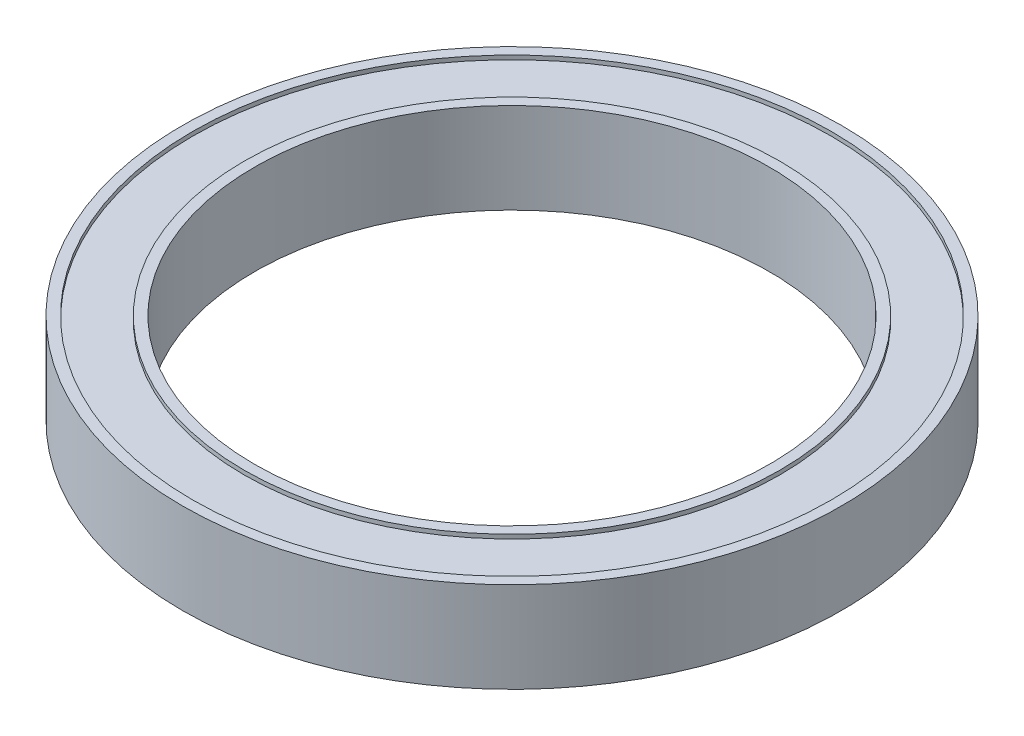
ISO-10303-21;
HEADER;
FILE_DESCRIPTION(('STEP AP214'),'2;1');
FILE_NAME('part.step','',(''),(''),'','','');
FILE_SCHEMA(('AUTOMOTIVE_DESIGN { 1 0 10303 214 1 1 1 1 }'));
ENDSEC;
DATA;
#1=APPLICATION_CONTEXT('core data for automotive mechanical design processes');
#2=APPLICATION_PROTOCOL_DEFINITION('international standard','automotive_design',2000,#1);
#3=PRODUCT_CONTEXT('',#1,'mechanical');
#4=PRODUCT('Part','Part','',(#3));
#5=PRODUCT_RELATED_PRODUCT_CATEGORY('part','',(#4));
#6=PRODUCT_DEFINITION_FORMATION('','',#4);
#7=PRODUCT_DEFINITION_CONTEXT('part definition',#1,'design');
#8=PRODUCT_DEFINITION('design','',#6,#7);
#9=PRODUCT_DEFINITION_SHAPE('','',#8);
#10=(LENGTH_UNIT() NAMED_UNIT(*) SI_UNIT(.MILLI.,.METRE.));
#11=(NAMED_UNIT(*) PLANE_ANGLE_UNIT() SI_UNIT($,.RADIAN.));
#12=(NAMED_UNIT(*) SI_UNIT($,.STERADIAN.) SOLID_ANGLE_UNIT());
#13=UNCERTAINTY_MEASURE_WITH_UNIT(LENGTH_MEASURE(1.E-05),#10,'distance_accuracy_value','');
#14=(GEOMETRIC_REPRESENTATION_CONTEXT(3) GLOBAL_UNCERTAINTY_ASSIGNED_CONTEXT((#13)) GLOBAL_UNIT_ASSIGNED_CONTEXT((#10,
#11,#12)) REPRESENTATION_CONTEXT('',''));
#15=CARTESIAN_POINT('',(0.,0.,0.));
#16=DIRECTION('',(0.,0.,1.));
#17=DIRECTION('',(1.,0.,0.));
#18=AXIS2_PLACEMENT_3D('',#15,#16,#17);
#19=CARTESIAN_POINT('',(0.,4.,0.));
#20=DIRECTION('',(0.,1.,0.));
#21=DIRECTION('',(0.,0.,1.));
#22=AXIS2_PLACEMENT_3D('',#19,#20,#21);
#23=PLANE('',#22);
#24=CARTESIAN_POINT('',(0.,4.,0.));
#25=DIRECTION('',(0.,1.,0.));
#26=DIRECTION('',(0.,0.,1.));
#27=AXIS2_PLACEMENT_3D('',#24,#25,#26);
#28=CIRCLE('',#27,13.);
#29=CARTESIAN_POINT('',(0.,4.,13.));
#30=VERTEX_POINT('',#29);
#31=EDGE_CURVE('E57',#30,#30,#28,.T.);
#32=ORIENTED_EDGE('',*,*,#31,.F.);
#33=EDGE_LOOP('',(#32));
#34=FACE_BOUND('',#33,.T.);
#35=CARTESIAN_POINT('',(0.,4.,0.));
#36=DIRECTION('',(0.,1.,0.));
#37=DIRECTION('',(0.,0.,1.));
#38=AXIS2_PLACEMENT_3D('',#35,#36,#37);
#39=CIRCLE('',#38,15.5);
#40=CARTESIAN_POINT('',(0.,4.,15.5));
#41=VERTEX_POINT('',#40);
#42=EDGE_CURVE('E79',#41,#41,#39,.T.);
#43=ORIENTED_EDGE('',*,*,#42,.T.);
#44=EDGE_LOOP('',(#43));
#45=FACE_BOUND('',#44,.T.);
#46=ADVANCED_FACE('F50',(#34,#45),#23,.T.);
#47=CARTESIAN_POINT('',(0.,0.,0.));
#48=DIRECTION('',(0.,1.,0.));
#49=DIRECTION('',(0.,0.,1.));
#50=AXIS2_PLACEMENT_3D('',#47,#48,#49);
#51=PLANE('',#50);
#52=CARTESIAN_POINT('',(0.,0.,0.));
#53=DIRECTION('',(0.,1.,0.));
#54=DIRECTION('',(0.,0.,1.));
#55=AXIS2_PLACEMENT_3D('',#52,#53,#54);
#56=CIRCLE('',#55,13.);
#57=CARTESIAN_POINT('',(0.,0.,13.));
#58=VERTEX_POINT('',#57);
#59=EDGE_CURVE('E61',#58,#58,#56,.T.);
#60=ORIENTED_EDGE('',*,*,#59,.T.);
#61=EDGE_LOOP('',(#60));
#62=FACE_BOUND('',#61,.T.);
#63=CARTESIAN_POINT('',(0.,0.,0.));
#64=DIRECTION('',(0.,1.,0.));
#65=DIRECTION('',(0.,0.,1.));
#66=AXIS2_PLACEMENT_3D('',#63,#64,#65);
#67=CIRCLE('',#66,15.5);
#68=CARTESIAN_POINT('',(0.,0.,15.5));
#69=VERTEX_POINT('',#68);
#70=EDGE_CURVE('E12',#69,#69,#67,.T.);
#71=ORIENTED_EDGE('',*,*,#70,.F.);
#72=EDGE_LOOP('',(#71));
#73=FACE_BOUND('',#72,.T.);
#74=ADVANCED_FACE('F109',(#62,#73),#51,.F.);
#75=CARTESIAN_POINT('',(0.,-0.2,0.));
#76=DIRECTION('',(0.,1.,0.));
#77=DIRECTION('',(0.,0.,1.));
#78=AXIS2_PLACEMENT_3D('',#75,#76,#77);
#79=PLANE('',#78);
#80=CARTESIAN_POINT('',(0.,-0.199999999999999,0.));
#81=DIRECTION('',(0.,1.,0.));
#82=DIRECTION('',(0.,0.,1.));
#83=AXIS2_PLACEMENT_3D('',#80,#81,#82);
#84=CIRCLE('',#83,12.5);
#85=CARTESIAN_POINT('',(0.,-0.199999999999999,12.5));
#86=VERTEX_POINT('',#85);
#87=EDGE_CURVE('E70',#86,#86,#84,.T.);
#88=ORIENTED_EDGE('',*,*,#87,.T.);
#89=EDGE_LOOP('',(#88));
#90=FACE_BOUND('',#89,.T.);
#91=CARTESIAN_POINT('',(0.,-0.199999999999999,0.));
#92=DIRECTION('',(0.,1.,0.));
#93=DIRECTION('',(0.,0.,1.));
#94=AXIS2_PLACEMENT_3D('',#91,#92,#93);
#95=CIRCLE('',#94,13.);
#96=CARTESIAN_POINT('',(0.,-0.199999999999999,13.));
#97=VERTEX_POINT('',#96);
#98=EDGE_CURVE('E66',#97,#97,#95,.F.);
#99=ORIENTED_EDGE('',*,*,#98,.T.);
#100=EDGE_LOOP('',(#99));
#101=FACE_BOUND('',#100,.T.);
#102=ADVANCED_FACE('F115',(#90,#101),#79,.F.);
#103=CARTESIAN_POINT('',(0.,-45.654833995939,0.));
#104=DIRECTION('',(0.,1.,0.));
#105=DIRECTION('',(0.,0.,1.));
#106=AXIS2_PLACEMENT_3D('',#103,#104,#105);
#107=CYLINDRICAL_SURFACE('',#106,13.);
#108=ORIENTED_EDGE('',*,*,#98,.F.);
#109=EDGE_LOOP('',(#108));
#110=FACE_BOUND('',#109,.T.);
#111=ORIENTED_EDGE('',*,*,#59,.F.);
#112=EDGE_LOOP('',(#111));
#113=FACE_BOUND('',#112,.T.);
#114=ADVANCED_FACE('F123',(#110,#113),#107,.T.);
#115=CARTESIAN_POINT('',(0.,4.,0.));
#116=DIRECTION('',(0.,-1.,0.));
#117=DIRECTION('',(0.,0.,-1.));
#118=AXIS2_PLACEMENT_3D('',#115,#116,#117);
#119=CYLINDRICAL_SURFACE('',#118,12.5);
#120=ORIENTED_EDGE('',*,*,#87,.F.);
#121=EDGE_LOOP('',(#120));
#122=FACE_BOUND('',#121,.T.);
#123=CARTESIAN_POINT('',(0.,4.2,0.));
#124=DIRECTION('',(0.,1.,0.));
#125=DIRECTION('',(0.,0.,1.));
#126=AXIS2_PLACEMENT_3D('',#123,#124,#125);
#127=CIRCLE('',#126,12.5);
#128=CARTESIAN_POINT('',(0.,4.2,12.5));
#129=VERTEX_POINT('',#128);
#130=EDGE_CURVE('E76',#129,#129,#127,.F.);
#131=ORIENTED_EDGE('',*,*,#130,.F.);
#132=EDGE_LOOP('',(#131));
#133=FACE_BOUND('',#132,.T.);
#134=ADVANCED_FACE('F119',(#122,#133),#119,.F.);
#135=ORIENTED_EDGE('',*,*,#31,.T.);
#136=EDGE_LOOP('',(#135));
#137=FACE_BOUND('',#136,.T.);
#138=CARTESIAN_POINT('',(0.,4.2,0.));
#139=DIRECTION('',(0.,1.,0.));
#140=DIRECTION('',(0.,0.,1.));
#141=AXIS2_PLACEMENT_3D('',#138,#139,#140);
#142=CIRCLE('',#141,13.);
#143=CARTESIAN_POINT('',(0.,4.2,13.));
#144=VERTEX_POINT('',#143);
#145=EDGE_CURVE('E73',#144,#144,#142,.T.);
#146=ORIENTED_EDGE('',*,*,#145,.F.);
#147=EDGE_LOOP('',(#146));
#148=FACE_BOUND('',#147,.T.);
#149=ADVANCED_FACE('F122',(#137,#148),#107,.T.);
#150=CARTESIAN_POINT('',(0.,4.2,0.));
#151=DIRECTION('',(0.,1.,0.));
#152=DIRECTION('',(0.,0.,1.));
#153=AXIS2_PLACEMENT_3D('',#150,#151,#152);
#154=PLANE('',#153);
#155=ORIENTED_EDGE('',*,*,#130,.T.);
#156=EDGE_LOOP('',(#155));
#157=FACE_BOUND('',#156,.T.);
#158=ORIENTED_EDGE('',*,*,#145,.T.);
#159=EDGE_LOOP('',(#158));
#160=FACE_BOUND('',#159,.T.);
#161=ADVANCED_FACE('F130',(#157,#160),#154,.T.);
#162=CARTESIAN_POINT('',(0.,-45.654833995939,0.));
#163=DIRECTION('',(0.,1.,0.));
#164=DIRECTION('',(0.,0.,1.));
#165=AXIS2_PLACEMENT_3D('',#162,#163,#164);
#166=CYLINDRICAL_SURFACE('',#165,15.5);
#167=CARTESIAN_POINT('',(0.,-0.199999999999999,0.));
#168=DIRECTION('',(0.,1.,0.));
#169=DIRECTION('',(0.,0.,1.));
#170=AXIS2_PLACEMENT_3D('',#167,#168,#169);
#171=CIRCLE('',#170,15.5);
#172=CARTESIAN_POINT('',(0.,-0.199999999999999,15.5));
#173=VERTEX_POINT('',#172);
#174=EDGE_CURVE('E85',#173,#173,#171,.F.);
#175=ORIENTED_EDGE('',*,*,#174,.T.);
#176=EDGE_LOOP('',(#175));
#177=FACE_BOUND('',#176,.T.);
#178=ORIENTED_EDGE('',*,*,#70,.T.);
#179=EDGE_LOOP('',(#178));
#180=FACE_BOUND('',#179,.T.);
#181=ADVANCED_FACE('F133',(#177,#180),#166,.F.);
#182=CARTESIAN_POINT('',(0.,-0.2,0.));
#183=DIRECTION('',(0.,1.,0.));
#184=DIRECTION('',(0.,0.,1.));
#185=AXIS2_PLACEMENT_3D('',#182,#183,#184);
#186=PLANE('',#185);
#187=CARTESIAN_POINT('',(0.,-0.199999999999999,0.));
#188=DIRECTION('',(0.,1.,0.));
#189=DIRECTION('',(0.,0.,1.));
#190=AXIS2_PLACEMENT_3D('',#187,#188,#189);
#191=CIRCLE('',#190,16.);
#192=CARTESIAN_POINT('',(0.,-0.199999999999999,16.));
#193=VERTEX_POINT('',#192);
#194=EDGE_CURVE('E82',#193,#193,#191,.F.);
#195=ORIENTED_EDGE('',*,*,#194,.T.);
#196=EDGE_LOOP('',(#195));
#197=FACE_BOUND('',#196,.T.);
#198=ORIENTED_EDGE('',*,*,#174,.F.);
#199=EDGE_LOOP('',(#198));
#200=FACE_BOUND('',#199,.T.);
#201=ADVANCED_FACE('F135',(#197,#200),#186,.F.);
#202=ORIENTED_EDGE('',*,*,#42,.F.);
#203=EDGE_LOOP('',(#202));
#204=FACE_BOUND('',#203,.T.);
#205=CARTESIAN_POINT('',(0.,4.2,0.));
#206=DIRECTION('',(0.,1.,0.));
#207=DIRECTION('',(0.,0.,1.));
#208=AXIS2_PLACEMENT_3D('',#205,#206,#207);
#209=CIRCLE('',#208,15.5);
#210=CARTESIAN_POINT('',(0.,4.2,15.5));
#211=VERTEX_POINT('',#210);
#212=EDGE_CURVE('E91',#211,#211,#209,.T.);
#213=ORIENTED_EDGE('',*,*,#212,.T.);
#214=EDGE_LOOP('',(#213));
#215=FACE_BOUND('',#214,.T.);
#216=ADVANCED_FACE('F95',(#204,#215),#166,.F.);
#217=CARTESIAN_POINT('',(0.,4.2,0.));
#218=DIRECTION('',(0.,1.,0.));
#219=DIRECTION('',(0.,0.,1.));
#220=AXIS2_PLACEMENT_3D('',#217,#218,#219);
#221=PLANE('',#220);
#222=ORIENTED_EDGE('',*,*,#212,.F.);
#223=EDGE_LOOP('',(#222));
#224=FACE_BOUND('',#223,.T.);
#225=CARTESIAN_POINT('',(0.,4.2,0.));
#226=DIRECTION('',(0.,1.,0.));
#227=DIRECTION('',(0.,0.,1.));
#228=AXIS2_PLACEMENT_3D('',#225,#226,#227);
#229=CIRCLE('',#228,16.);
#230=CARTESIAN_POINT('',(0.,4.2,16.));
#231=VERTEX_POINT('',#230);
#232=EDGE_CURVE('E88',#231,#231,#229,.T.);
#233=ORIENTED_EDGE('',*,*,#232,.T.);
#234=EDGE_LOOP('',(#233));
#235=FACE_BOUND('',#234,.T.);
#236=ADVANCED_FACE('F97',(#224,#235),#221,.T.);
#237=CARTESIAN_POINT('',(0.,4.,0.));
#238=DIRECTION('',(0.,-1.,0.));
#239=DIRECTION('',(0.,0.,-1.));
#240=AXIS2_PLACEMENT_3D('',#237,#238,#239);
#241=CYLINDRICAL_SURFACE('',#240,16.);
#242=ORIENTED_EDGE('',*,*,#194,.F.);
#243=EDGE_LOOP('',(#242));
#244=FACE_BOUND('',#243,.T.);
#245=ORIENTED_EDGE('',*,*,#232,.F.);
#246=EDGE_LOOP('',(#245));
#247=FACE_BOUND('',#246,.T.);
#248=ADVANCED_FACE('F52',(#244,#247),#241,.T.);
#249=CLOSED_SHELL('',(#46,#74,#102,#114,#134,#149,#161,#181,#201,#216,#236,#248));
#250=MANIFOLD_SOLID_BREP('B2',#249);
#251=ADVANCED_BREP_SHAPE_REPRESENTATION('',(#18,#250),#14);
#252=SHAPE_DEFINITION_REPRESENTATION(#9,#251);
ENDSEC;
END-ISO-10303-21;
